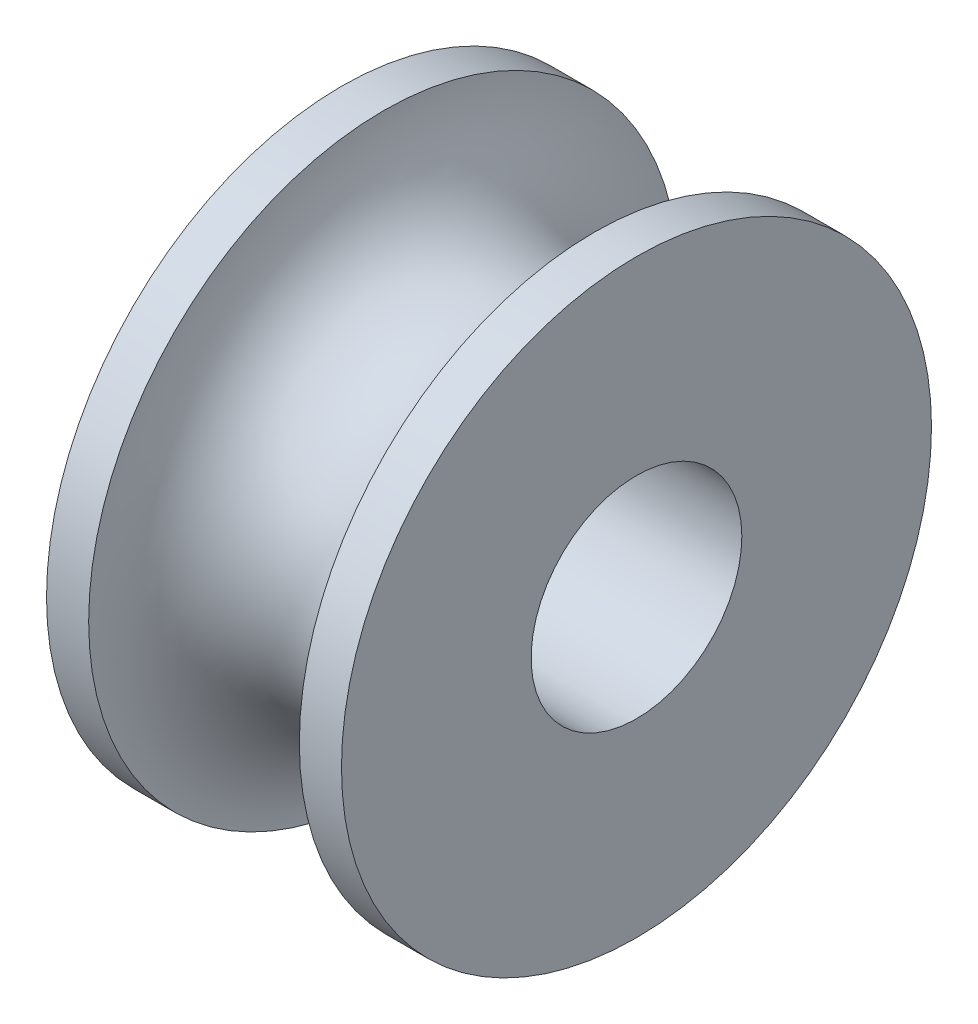
ISO-10303-21;
HEADER;
FILE_DESCRIPTION(('STEP AP214'),'2;1');
FILE_NAME('part.step','',(''),(''),'','','');
FILE_SCHEMA(('AUTOMOTIVE_DESIGN { 1 0 10303 214 1 1 1 1 }'));
ENDSEC;
DATA;
#1=APPLICATION_CONTEXT('core data for automotive mechanical design processes');
#2=APPLICATION_PROTOCOL_DEFINITION('international standard','automotive_design',2000,#1);
#3=PRODUCT_CONTEXT('',#1,'mechanical');
#4=PRODUCT('Part','Part','',(#3));
#5=PRODUCT_RELATED_PRODUCT_CATEGORY('part','',(#4));
#6=PRODUCT_DEFINITION_FORMATION('','',#4);
#7=PRODUCT_DEFINITION_CONTEXT('part definition',#1,'design');
#8=PRODUCT_DEFINITION('design','',#6,#7);
#9=PRODUCT_DEFINITION_SHAPE('','',#8);
#10=(LENGTH_UNIT() NAMED_UNIT(*) SI_UNIT(.MILLI.,.METRE.));
#11=(NAMED_UNIT(*) PLANE_ANGLE_UNIT() SI_UNIT($,.RADIAN.));
#12=(NAMED_UNIT(*) SI_UNIT($,.STERADIAN.) SOLID_ANGLE_UNIT());
#13=UNCERTAINTY_MEASURE_WITH_UNIT(LENGTH_MEASURE(1.E-05),#10,'distance_accuracy_value','');
#14=(GEOMETRIC_REPRESENTATION_CONTEXT(3) GLOBAL_UNCERTAINTY_ASSIGNED_CONTEXT((#13)) GLOBAL_UNIT_ASSIGNED_CONTEXT((#10,
#11,#12)) REPRESENTATION_CONTEXT('',''));
#15=CARTESIAN_POINT('',(0.,0.,0.));
#16=DIRECTION('',(0.,0.,1.));
#17=DIRECTION('',(1.,0.,0.));
#18=AXIS2_PLACEMENT_3D('',#15,#16,#17);
#19=CARTESIAN_POINT('',(0.,2.5,0.));
#20=DIRECTION('',(-1.,0.,0.));
#21=DIRECTION('',(0.,0.,1.));
#22=AXIS2_PLACEMENT_3D('',#19,#20,#21);
#23=PLANE('',#22);
#24=CARTESIAN_POINT('',(0.,0.,0.));
#25=DIRECTION('',(1.,0.,0.));
#26=DIRECTION('',(0.,0.,-1.));
#27=AXIS2_PLACEMENT_3D('',#24,#25,#26);
#28=CIRCLE('',#27,2.5);
#29=CARTESIAN_POINT('',(0.,0.,-2.5));
#30=VERTEX_POINT('',#29);
#31=EDGE_CURVE('E10',#30,#30,#28,.T.);
#32=ORIENTED_EDGE('',*,*,#31,.T.);
#33=EDGE_LOOP('',(#32));
#34=FACE_BOUND('',#33,.T.);
#35=CARTESIAN_POINT('',(0.,0.,0.));
#36=DIRECTION('',(1.,0.,0.));
#37=DIRECTION('',(0.,0.,-1.));
#38=AXIS2_PLACEMENT_3D('',#35,#36,#37);
#39=CIRCLE('',#38,7.);
#40=CARTESIAN_POINT('',(0.,0.,-7.));
#41=VERTEX_POINT('',#40);
#42=EDGE_CURVE('E57',#41,#41,#39,.T.);
#43=ORIENTED_EDGE('',*,*,#42,.F.);
#44=EDGE_LOOP('',(#43));
#45=FACE_BOUND('',#44,.T.);
#46=ADVANCED_FACE('F35',(#34,#45),#23,.T.);
#47=CARTESIAN_POINT('',(0.,0.,0.));
#48=DIRECTION('',(1.,0.,0.));
#49=DIRECTION('',(0.,0.,-1.));
#50=AXIS2_PLACEMENT_3D('',#47,#48,#49);
#51=CYLINDRICAL_SURFACE('',#50,2.5);
#52=CARTESIAN_POINT('',(6.9988664414561,0.,0.));
#53=DIRECTION('',(1.,0.,0.));
#54=DIRECTION('',(0.,0.,-1.));
#55=AXIS2_PLACEMENT_3D('',#52,#53,#54);
#56=CIRCLE('',#55,2.5);
#57=CARTESIAN_POINT('',(6.9988664414561,0.,-2.5));
#58=VERTEX_POINT('',#57);
#59=EDGE_CURVE('E41',#58,#58,#56,.T.);
#60=ORIENTED_EDGE('',*,*,#59,.T.);
#61=EDGE_LOOP('',(#60));
#62=FACE_BOUND('',#61,.T.);
#63=ORIENTED_EDGE('',*,*,#31,.F.);
#64=EDGE_LOOP('',(#63));
#65=FACE_BOUND('',#64,.T.);
#66=ADVANCED_FACE('F65',(#62,#65),#51,.F.);
#67=CARTESIAN_POINT('',(6.9988664414561,7.,0.));
#68=DIRECTION('',(1.,0.,0.));
#69=DIRECTION('',(0.,0.,-1.));
#70=AXIS2_PLACEMENT_3D('',#67,#68,#69);
#71=PLANE('',#70);
#72=CARTESIAN_POINT('',(6.9988664414561,0.,0.));
#73=DIRECTION('',(1.,0.,0.));
#74=DIRECTION('',(0.,0.,-1.));
#75=AXIS2_PLACEMENT_3D('',#72,#73,#74);
#76=CIRCLE('',#75,7.);
#77=CARTESIAN_POINT('',(6.9988664414561,0.,-7.));
#78=VERTEX_POINT('',#77);
#79=EDGE_CURVE('E45',#78,#78,#76,.T.);
#80=ORIENTED_EDGE('',*,*,#79,.T.);
#81=EDGE_LOOP('',(#80));
#82=FACE_BOUND('',#81,.T.);
#83=ORIENTED_EDGE('',*,*,#59,.F.);
#84=EDGE_LOOP('',(#83));
#85=FACE_BOUND('',#84,.T.);
#86=ADVANCED_FACE('F69',(#82,#85),#71,.T.);
#87=CARTESIAN_POINT('',(0.,0.,0.));
#88=DIRECTION('',(1.,0.,0.));
#89=DIRECTION('',(0.,0.,-1.));
#90=AXIS2_PLACEMENT_3D('',#87,#88,#89);
#91=CYLINDRICAL_SURFACE('',#90,7.);
#92=CARTESIAN_POINT('',(5.9988664414561,0.,0.));
#93=DIRECTION('',(1.,0.,0.));
#94=DIRECTION('',(0.,0.,-1.));
#95=AXIS2_PLACEMENT_3D('',#92,#93,#94);
#96=CIRCLE('',#95,7.);
#97=CARTESIAN_POINT('',(5.9988664414561,0.,-7.));
#98=VERTEX_POINT('',#97);
#99=EDGE_CURVE('E49',#98,#98,#96,.T.);
#100=ORIENTED_EDGE('',*,*,#99,.T.);
#101=EDGE_LOOP('',(#100));
#102=FACE_BOUND('',#101,.T.);
#103=ORIENTED_EDGE('',*,*,#79,.F.);
#104=EDGE_LOOP('',(#103));
#105=FACE_BOUND('',#104,.T.);
#106=ADVANCED_FACE('F73',(#102,#105),#91,.T.);
#107=CARTESIAN_POINT('',(3.49943322072805,0.,0.));
#108=DIRECTION('',(1.,0.,0.));
#109=DIRECTION('',(0.,0.,-1.));
#110=AXIS2_PLACEMENT_3D('',#107,#108,#109);
#111=TOROIDAL_SURFACE('',#110,6.94676866410638,2.5);
#112=CARTESIAN_POINT('',(1.,0.,0.));
#113=DIRECTION('',(1.,0.,0.));
#114=DIRECTION('',(0.,0.,-1.));
#115=AXIS2_PLACEMENT_3D('',#112,#113,#114);
#116=CIRCLE('',#115,7.);
#117=CARTESIAN_POINT('',(1.,0.,-7.));
#118=VERTEX_POINT('',#117);
#119=EDGE_CURVE('E54',#118,#118,#116,.T.);
#120=ORIENTED_EDGE('',*,*,#119,.T.);
#121=EDGE_LOOP('',(#120));
#122=FACE_BOUND('',#121,.T.);
#123=ORIENTED_EDGE('',*,*,#99,.F.);
#124=EDGE_LOOP('',(#123));
#125=FACE_BOUND('',#124,.T.);
#126=ADVANCED_FACE('F80',(#122,#125),#111,.F.);
#127=CARTESIAN_POINT('',(0.,0.,0.));
#128=DIRECTION('',(1.,0.,0.));
#129=DIRECTION('',(0.,0.,-1.));
#130=AXIS2_PLACEMENT_3D('',#127,#128,#129);
#131=CYLINDRICAL_SURFACE('',#130,7.);
#132=ORIENTED_EDGE('',*,*,#42,.T.);
#133=EDGE_LOOP('',(#132));
#134=FACE_BOUND('',#133,.T.);
#135=ORIENTED_EDGE('',*,*,#119,.F.);
#136=EDGE_LOOP('',(#135));
#137=FACE_BOUND('',#136,.T.);
#138=ADVANCED_FACE('F61',(#134,#137),#131,.T.);
#139=CLOSED_SHELL('',(#46,#66,#86,#106,#126,#138));
#140=MANIFOLD_SOLID_BREP('B2',#139);
#141=ADVANCED_BREP_SHAPE_REPRESENTATION('',(#18,#140),#14);
#142=SHAPE_DEFINITION_REPRESENTATION(#9,#141);
ENDSEC;
END-ISO-10303-21;
